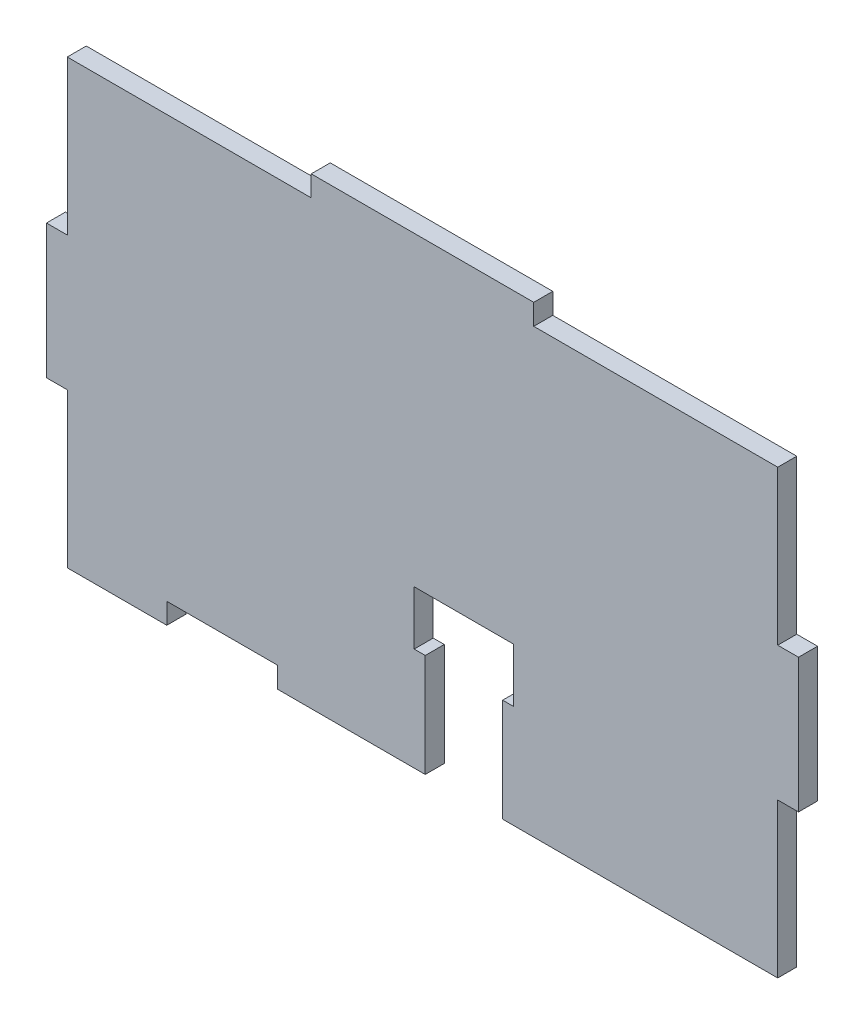
ISO-10303-21;
HEADER;
FILE_DESCRIPTION(('STEP AP214'),'2;1');
FILE_NAME('part.step','',(''),(''),'','','');
FILE_SCHEMA(('AUTOMOTIVE_DESIGN { 1 0 10303 214 1 1 1 1 }'));
ENDSEC;
DATA;
#1=APPLICATION_CONTEXT('core data for automotive mechanical design processes');
#2=APPLICATION_PROTOCOL_DEFINITION('international standard','automotive_design',2000,#1);
#3=PRODUCT_CONTEXT('',#1,'mechanical');
#4=PRODUCT('Part','Part','',(#3));
#5=PRODUCT_RELATED_PRODUCT_CATEGORY('part','',(#4));
#6=PRODUCT_DEFINITION_FORMATION('','',#4);
#7=PRODUCT_DEFINITION_CONTEXT('part definition',#1,'design');
#8=PRODUCT_DEFINITION('design','',#6,#7);
#9=PRODUCT_DEFINITION_SHAPE('','',#8);
#10=(LENGTH_UNIT() NAMED_UNIT(*) SI_UNIT(.MILLI.,.METRE.));
#11=(NAMED_UNIT(*) PLANE_ANGLE_UNIT() SI_UNIT($,.RADIAN.));
#12=(NAMED_UNIT(*) SI_UNIT($,.STERADIAN.) SOLID_ANGLE_UNIT());
#13=UNCERTAINTY_MEASURE_WITH_UNIT(LENGTH_MEASURE(1.E-05),#10,'distance_accuracy_value','');
#14=(GEOMETRIC_REPRESENTATION_CONTEXT(3) GLOBAL_UNCERTAINTY_ASSIGNED_CONTEXT((#13)) GLOBAL_UNIT_ASSIGNED_CONTEXT((#10,
#11,#12)) REPRESENTATION_CONTEXT('',''));
#15=CARTESIAN_POINT('',(0.,0.,0.));
#16=DIRECTION('',(0.,0.,1.));
#17=DIRECTION('',(1.,0.,0.));
#18=AXIS2_PLACEMENT_3D('',#15,#16,#17);
#19=CARTESIAN_POINT('',(0.,0.,4.3));
#20=DIRECTION('',(1.,0.,0.));
#21=DIRECTION('',(0.,0.,-1.));
#22=AXIS2_PLACEMENT_3D('',#19,#20,#21);
#23=PLANE('',#22);
#24=DIRECTION('',(0.,-1.,0.));
#25=VECTOR('',#24,1.);
#26=CARTESIAN_POINT('',(0.,0.,0.));
#27=LINE('',#26,#25);
#28=CARTESIAN_POINT('',(0.,34.85,0.));
#29=VERTEX_POINT('',#28);
#30=CARTESIAN_POINT('',(0.,0.,0.));
#31=VERTEX_POINT('',#30);
#32=EDGE_CURVE('E252',#29,#31,#27,.T.);
#33=ORIENTED_EDGE('',*,*,#32,.T.);
#34=DIRECTION('',(0.,0.,-1.));
#35=VECTOR('',#34,1.);
#36=CARTESIAN_POINT('',(0.,0.,4.3));
#37=LINE('',#36,#35);
#38=CARTESIAN_POINT('',(0.,0.,4.3));
#39=VERTEX_POINT('',#38);
#40=EDGE_CURVE('E11',#39,#31,#37,.T.);
#41=ORIENTED_EDGE('',*,*,#40,.F.);
#42=DIRECTION('',(0.,-1.,0.));
#43=VECTOR('',#42,1.);
#44=CARTESIAN_POINT('',(0.,0.,4.3));
#45=LINE('',#44,#43);
#46=CARTESIAN_POINT('',(0.,34.85,4.3));
#47=VERTEX_POINT('',#46);
#48=EDGE_CURVE('E308',#47,#39,#45,.T.);
#49=ORIENTED_EDGE('',*,*,#48,.F.);
#50=DIRECTION('',(0.,0.,-1.));
#51=VECTOR('',#50,1.);
#52=CARTESIAN_POINT('',(0.,34.85,4.3));
#53=LINE('',#52,#51);
#54=EDGE_CURVE('E248',#47,#29,#53,.T.);
#55=ORIENTED_EDGE('',*,*,#54,.T.);
#56=EDGE_LOOP('',(#33,#41,#49,#55));
#57=FACE_BOUND('',#56,.T.);
#58=ADVANCED_FACE('F36',(#57),#23,.F.);
#59=CARTESIAN_POINT('',(0.,0.,4.3));
#60=DIRECTION('',(0.,1.,0.));
#61=DIRECTION('',(-1.,0.,0.));
#62=AXIS2_PLACEMENT_3D('',#59,#60,#61);
#63=PLANE('',#62);
#64=DIRECTION('',(1.,0.,0.));
#65=VECTOR('',#64,1.);
#66=CARTESIAN_POINT('',(0.,0.,0.));
#67=LINE('',#66,#65);
#68=CARTESIAN_POINT('',(22.5,0.,0.));
#69=VERTEX_POINT('',#68);
#70=EDGE_CURVE('E255',#31,#69,#67,.T.);
#71=ORIENTED_EDGE('',*,*,#70,.T.);
#72=DIRECTION('',(0.,0.,-1.));
#73=VECTOR('',#72,1.);
#74=CARTESIAN_POINT('',(22.5,0.,4.3));
#75=LINE('',#74,#73);
#76=CARTESIAN_POINT('',(22.5,0.,4.3));
#77=VERTEX_POINT('',#76);
#78=EDGE_CURVE('E44',#77,#69,#75,.T.);
#79=ORIENTED_EDGE('',*,*,#78,.F.);
#80=DIRECTION('',(1.,0.,0.));
#81=VECTOR('',#80,1.);
#82=CARTESIAN_POINT('',(0.,0.,4.3));
#83=LINE('',#82,#81);
#84=EDGE_CURVE('E155',#39,#77,#83,.T.);
#85=ORIENTED_EDGE('',*,*,#84,.F.);
#86=ORIENTED_EDGE('',*,*,#40,.T.);
#87=EDGE_LOOP('',(#71,#79,#85,#86));
#88=FACE_BOUND('',#87,.T.);
#89=ADVANCED_FACE('F465',(#88),#63,.F.);
#90=CARTESIAN_POINT('',(22.5,0.,4.3));
#91=DIRECTION('',(-1.,0.,0.));
#92=DIRECTION('',(0.,0.,1.));
#93=AXIS2_PLACEMENT_3D('',#90,#91,#92);
#94=PLANE('',#93);
#95=DIRECTION('',(0.,1.,0.));
#96=VECTOR('',#95,1.);
#97=CARTESIAN_POINT('',(22.5,0.,0.));
#98=LINE('',#97,#96);
#99=CARTESIAN_POINT('',(22.5,4.7,0.));
#100=VERTEX_POINT('',#99);
#101=EDGE_CURVE('E257',#69,#100,#98,.T.);
#102=ORIENTED_EDGE('',*,*,#101,.T.);
#103=DIRECTION('',(0.,0.,-1.));
#104=VECTOR('',#103,1.);
#105=CARTESIAN_POINT('',(22.5,4.7,4.3));
#106=LINE('',#105,#104);
#107=CARTESIAN_POINT('',(22.5,4.7,4.3));
#108=VERTEX_POINT('',#107);
#109=EDGE_CURVE('E375',#108,#100,#106,.T.);
#110=ORIENTED_EDGE('',*,*,#109,.F.);
#111=DIRECTION('',(0.,1.,0.));
#112=VECTOR('',#111,1.);
#113=CARTESIAN_POINT('',(22.5,0.,4.3));
#114=LINE('',#113,#112);
#115=EDGE_CURVE('E383',#77,#108,#114,.T.);
#116=ORIENTED_EDGE('',*,*,#115,.F.);
#117=ORIENTED_EDGE('',*,*,#78,.T.);
#118=EDGE_LOOP('',(#102,#110,#116,#117));
#119=FACE_BOUND('',#118,.T.);
#120=ADVANCED_FACE('F381',(#119),#94,.F.);
#121=CARTESIAN_POINT('',(22.5,4.7,4.3));
#122=DIRECTION('',(0.,1.,0.));
#123=DIRECTION('',(-1.,0.,0.));
#124=AXIS2_PLACEMENT_3D('',#121,#122,#123);
#125=PLANE('',#124);
#126=DIRECTION('',(1.,0.,0.));
#127=VECTOR('',#126,1.);
#128=CARTESIAN_POINT('',(22.5,4.7,0.));
#129=LINE('',#128,#127);
#130=CARTESIAN_POINT('',(47.5,4.70000000000001,0.));
#131=VERTEX_POINT('',#130);
#132=EDGE_CURVE('E259',#100,#131,#129,.T.);
#133=ORIENTED_EDGE('',*,*,#132,.T.);
#134=DIRECTION('',(0.,0.,-1.));
#135=VECTOR('',#134,1.);
#136=CARTESIAN_POINT('',(47.5,4.70000000000001,4.3));
#137=LINE('',#136,#135);
#138=CARTESIAN_POINT('',(47.5,4.70000000000001,4.3));
#139=VERTEX_POINT('',#138);
#140=EDGE_CURVE('E372',#139,#131,#137,.T.);
#141=ORIENTED_EDGE('',*,*,#140,.F.);
#142=DIRECTION('',(1.,0.,0.));
#143=VECTOR('',#142,1.);
#144=CARTESIAN_POINT('',(22.5,4.7,4.3));
#145=LINE('',#144,#143);
#146=EDGE_CURVE('E400',#108,#139,#145,.T.);
#147=ORIENTED_EDGE('',*,*,#146,.F.);
#148=ORIENTED_EDGE('',*,*,#109,.T.);
#149=EDGE_LOOP('',(#133,#141,#147,#148));
#150=FACE_BOUND('',#149,.T.);
#151=ADVANCED_FACE('F391',(#150),#125,.F.);
#152=CARTESIAN_POINT('',(47.5,0.,4.3));
#153=DIRECTION('',(1.,0.,0.));
#154=DIRECTION('',(0.,1.,0.));
#155=AXIS2_PLACEMENT_3D('',#152,#153,#154);
#156=PLANE('',#155);
#157=DIRECTION('',(0.,-1.,0.));
#158=VECTOR('',#157,1.);
#159=CARTESIAN_POINT('',(47.5,0.,0.));
#160=LINE('',#159,#158);
#161=CARTESIAN_POINT('',(47.5,0.,0.));
#162=VERTEX_POINT('',#161);
#163=EDGE_CURVE('E261',#131,#162,#160,.T.);
#164=ORIENTED_EDGE('',*,*,#163,.T.);
#165=DIRECTION('',(0.,0.,-1.));
#166=VECTOR('',#165,1.);
#167=CARTESIAN_POINT('',(47.5,0.,4.3));
#168=LINE('',#167,#166);
#169=CARTESIAN_POINT('',(47.5,0.,4.3));
#170=VERTEX_POINT('',#169);
#171=EDGE_CURVE('E369',#170,#162,#168,.T.);
#172=ORIENTED_EDGE('',*,*,#171,.F.);
#173=DIRECTION('',(0.,-1.,0.));
#174=VECTOR('',#173,1.);
#175=CARTESIAN_POINT('',(47.5,0.,4.3));
#176=LINE('',#175,#174);
#177=EDGE_CURVE('E397',#139,#170,#176,.T.);
#178=ORIENTED_EDGE('',*,*,#177,.F.);
#179=ORIENTED_EDGE('',*,*,#140,.T.);
#180=EDGE_LOOP('',(#164,#172,#178,#179));
#181=FACE_BOUND('',#180,.T.);
#182=ADVANCED_FACE('F395',(#181),#156,.F.);
#183=CARTESIAN_POINT('',(80.92,0.,4.3));
#184=DIRECTION('',(0.,1.,0.));
#185=DIRECTION('',(-1.,0.,0.));
#186=AXIS2_PLACEMENT_3D('',#183,#184,#185);
#187=PLANE('',#186);
#188=DIRECTION('',(1.,0.,0.));
#189=VECTOR('',#188,1.);
#190=CARTESIAN_POINT('',(80.92,0.,0.));
#191=LINE('',#190,#189);
#192=CARTESIAN_POINT('',(80.92,0.,0.));
#193=VERTEX_POINT('',#192);
#194=EDGE_CURVE('E264',#162,#193,#191,.T.);
#195=ORIENTED_EDGE('',*,*,#194,.T.);
#196=DIRECTION('',(0.,0.,-1.));
#197=VECTOR('',#196,1.);
#198=CARTESIAN_POINT('',(80.92,0.,4.3));
#199=LINE('',#198,#197);
#200=CARTESIAN_POINT('',(80.92,0.,4.3));
#201=VERTEX_POINT('',#200);
#202=EDGE_CURVE('E366',#201,#193,#199,.T.);
#203=ORIENTED_EDGE('',*,*,#202,.F.);
#204=DIRECTION('',(1.,0.,0.));
#205=VECTOR('',#204,1.);
#206=CARTESIAN_POINT('',(47.5,0.,4.3));
#207=LINE('',#206,#205);
#208=EDGE_CURVE('E399',#170,#201,#207,.T.);
#209=ORIENTED_EDGE('',*,*,#208,.F.);
#210=ORIENTED_EDGE('',*,*,#171,.T.);
#211=EDGE_LOOP('',(#195,#203,#209,#210));
#212=FACE_BOUND('',#211,.T.);
#213=ADVANCED_FACE('F478',(#212),#187,.F.);
#214=CARTESIAN_POINT('',(80.92,23.3000000001531,4.3));
#215=DIRECTION('',(-1.,0.,0.));
#216=DIRECTION('',(0.,0.,1.));
#217=AXIS2_PLACEMENT_3D('',#214,#215,#216);
#218=PLANE('',#217);
#219=DIRECTION('',(0.,1.,0.));
#220=VECTOR('',#219,1.);
#221=CARTESIAN_POINT('',(80.92,23.3000000001531,0.));
#222=LINE('',#221,#220);
#223=CARTESIAN_POINT('',(80.92,23.3000000001531,0.));
#224=VERTEX_POINT('',#223);
#225=EDGE_CURVE('E266',#193,#224,#222,.T.);
#226=ORIENTED_EDGE('',*,*,#225,.T.);
#227=DIRECTION('',(0.,0.,-1.));
#228=VECTOR('',#227,1.);
#229=CARTESIAN_POINT('',(80.92,23.3000000001531,4.3));
#230=LINE('',#229,#228);
#231=CARTESIAN_POINT('',(80.92,23.3000000001531,4.3));
#232=VERTEX_POINT('',#231);
#233=EDGE_CURVE('E363',#232,#224,#230,.T.);
#234=ORIENTED_EDGE('',*,*,#233,.F.);
#235=DIRECTION('',(0.,1.,0.));
#236=VECTOR('',#235,1.);
#237=CARTESIAN_POINT('',(80.92,23.3000000001531,4.3));
#238=LINE('',#237,#236);
#239=EDGE_CURVE('E402',#201,#232,#238,.T.);
#240=ORIENTED_EDGE('',*,*,#239,.F.);
#241=ORIENTED_EDGE('',*,*,#202,.T.);
#242=EDGE_LOOP('',(#226,#234,#240,#241));
#243=FACE_BOUND('',#242,.T.);
#244=ADVANCED_FACE('F481',(#243),#218,.F.);
#245=CARTESIAN_POINT('',(78.42,23.3000000001531,4.3));
#246=DIRECTION('',(0.,-1.,0.));
#247=DIRECTION('',(0.,0.,-1.));
#248=AXIS2_PLACEMENT_3D('',#245,#246,#247);
#249=PLANE('',#248);
#250=DIRECTION('',(-1.,0.,0.));
#251=VECTOR('',#250,1.);
#252=CARTESIAN_POINT('',(78.42,23.3000000001531,0.));
#253=LINE('',#252,#251);
#254=CARTESIAN_POINT('',(78.42,23.3000000001531,0.));
#255=VERTEX_POINT('',#254);
#256=EDGE_CURVE('E268',#224,#255,#253,.T.);
#257=ORIENTED_EDGE('',*,*,#256,.T.);
#258=DIRECTION('',(0.,0.,-1.));
#259=VECTOR('',#258,1.);
#260=CARTESIAN_POINT('',(78.42,23.3000000001531,4.3));
#261=LINE('',#260,#259);
#262=CARTESIAN_POINT('',(78.42,23.3000000001531,4.3));
#263=VERTEX_POINT('',#262);
#264=EDGE_CURVE('E360',#263,#255,#261,.T.);
#265=ORIENTED_EDGE('',*,*,#264,.F.);
#266=DIRECTION('',(-1.,0.,0.));
#267=VECTOR('',#266,1.);
#268=CARTESIAN_POINT('',(78.42,23.3000000001531,4.3));
#269=LINE('',#268,#267);
#270=EDGE_CURVE('E408',#232,#263,#269,.T.);
#271=ORIENTED_EDGE('',*,*,#270,.F.);
#272=ORIENTED_EDGE('',*,*,#233,.T.);
#273=EDGE_LOOP('',(#257,#265,#271,#272));
#274=FACE_BOUND('',#273,.T.);
#275=ADVANCED_FACE('F485',(#274),#249,.F.);
#276=CARTESIAN_POINT('',(78.42,23.3000000001531,4.3));
#277=DIRECTION('',(-1.,0.,0.));
#278=DIRECTION('',(0.,0.,1.));
#279=AXIS2_PLACEMENT_3D('',#276,#277,#278);
#280=PLANE('',#279);
#281=DIRECTION('',(0.,1.,0.));
#282=VECTOR('',#281,1.);
#283=CARTESIAN_POINT('',(78.42,23.3000000001531,0.));
#284=LINE('',#283,#282);
#285=CARTESIAN_POINT('',(78.42,35.5000000001531,0.));
#286=VERTEX_POINT('',#285);
#287=EDGE_CURVE('E270',#255,#286,#284,.T.);
#288=ORIENTED_EDGE('',*,*,#287,.T.);
#289=DIRECTION('',(0.,0.,-1.));
#290=VECTOR('',#289,1.);
#291=CARTESIAN_POINT('',(78.42,35.5000000001531,4.3));
#292=LINE('',#291,#290);
#293=CARTESIAN_POINT('',(78.42,35.5000000001531,4.3));
#294=VERTEX_POINT('',#293);
#295=EDGE_CURVE('E357',#294,#286,#292,.T.);
#296=ORIENTED_EDGE('',*,*,#295,.F.);
#297=DIRECTION('',(0.,1.,0.));
#298=VECTOR('',#297,1.);
#299=CARTESIAN_POINT('',(78.42,23.3000000001531,4.3));
#300=LINE('',#299,#298);
#301=EDGE_CURVE('E410',#263,#294,#300,.T.);
#302=ORIENTED_EDGE('',*,*,#301,.F.);
#303=ORIENTED_EDGE('',*,*,#264,.T.);
#304=EDGE_LOOP('',(#288,#296,#302,#303));
#305=FACE_BOUND('',#304,.T.);
#306=ADVANCED_FACE('F489',(#305),#280,.F.);
#307=CARTESIAN_POINT('',(78.42,35.5000000001531,4.3));
#308=DIRECTION('',(0.,1.,0.));
#309=DIRECTION('',(0.,0.,1.));
#310=AXIS2_PLACEMENT_3D('',#307,#308,#309);
#311=PLANE('',#310);
#312=DIRECTION('',(1.,0.,0.));
#313=VECTOR('',#312,1.);
#314=CARTESIAN_POINT('',(78.42,35.5000000001531,0.));
#315=LINE('',#314,#313);
#316=CARTESIAN_POINT('',(100.92,35.5000000001531,0.));
#317=VERTEX_POINT('',#316);
#318=EDGE_CURVE('E272',#286,#317,#315,.T.);
#319=ORIENTED_EDGE('',*,*,#318,.T.);
#320=DIRECTION('',(0.,0.,-1.));
#321=VECTOR('',#320,1.);
#322=CARTESIAN_POINT('',(100.92,35.5000000001531,4.3));
#323=LINE('',#322,#321);
#324=CARTESIAN_POINT('',(100.92,35.5000000001531,4.3));
#325=VERTEX_POINT('',#324);
#326=EDGE_CURVE('E354',#325,#317,#323,.T.);
#327=ORIENTED_EDGE('',*,*,#326,.F.);
#328=DIRECTION('',(1.,0.,0.));
#329=VECTOR('',#328,1.);
#330=CARTESIAN_POINT('',(78.42,35.5000000001531,4.3));
#331=LINE('',#330,#329);
#332=EDGE_CURVE('E412',#294,#325,#331,.T.);
#333=ORIENTED_EDGE('',*,*,#332,.F.);
#334=ORIENTED_EDGE('',*,*,#295,.T.);
#335=EDGE_LOOP('',(#319,#327,#333,#334));
#336=FACE_BOUND('',#335,.T.);
#337=ADVANCED_FACE('F493',(#336),#311,.F.);
#338=CARTESIAN_POINT('',(100.92,23.3000000001531,4.3));
#339=DIRECTION('',(1.,0.,0.));
#340=DIRECTION('',(0.,0.,-1.));
#341=AXIS2_PLACEMENT_3D('',#338,#339,#340);
#342=PLANE('',#341);
#343=DIRECTION('',(0.,-1.,0.));
#344=VECTOR('',#343,1.);
#345=CARTESIAN_POINT('',(100.92,23.3000000001531,0.));
#346=LINE('',#345,#344);
#347=CARTESIAN_POINT('',(100.92,23.3000000001531,0.));
#348=VERTEX_POINT('',#347);
#349=EDGE_CURVE('E274',#317,#348,#346,.T.);
#350=ORIENTED_EDGE('',*,*,#349,.T.);
#351=DIRECTION('',(0.,0.,-1.));
#352=VECTOR('',#351,1.);
#353=CARTESIAN_POINT('',(100.92,23.3000000001531,4.3));
#354=LINE('',#353,#352);
#355=CARTESIAN_POINT('',(100.92,23.3000000001531,4.3));
#356=VERTEX_POINT('',#355);
#357=EDGE_CURVE('E351',#356,#348,#354,.T.);
#358=ORIENTED_EDGE('',*,*,#357,.F.);
#359=DIRECTION('',(0.,-1.,0.));
#360=VECTOR('',#359,1.);
#361=CARTESIAN_POINT('',(100.92,23.3000000001531,4.3));
#362=LINE('',#361,#360);
#363=EDGE_CURVE('E414',#325,#356,#362,.T.);
#364=ORIENTED_EDGE('',*,*,#363,.F.);
#365=ORIENTED_EDGE('',*,*,#326,.T.);
#366=EDGE_LOOP('',(#350,#358,#364,#365));
#367=FACE_BOUND('',#366,.T.);
#368=ADVANCED_FACE('F497',(#367),#342,.F.);
#369=CARTESIAN_POINT('',(100.92,23.3000000001531,4.3));
#370=DIRECTION('',(0.,-1.,0.));
#371=DIRECTION('',(1.,0.,0.));
#372=AXIS2_PLACEMENT_3D('',#369,#370,#371);
#373=PLANE('',#372);
#374=DIRECTION('',(-1.,0.,0.));
#375=VECTOR('',#374,1.);
#376=CARTESIAN_POINT('',(100.92,23.3000000001531,0.));
#377=LINE('',#376,#375);
#378=CARTESIAN_POINT('',(98.42,23.3000000001531,0.));
#379=VERTEX_POINT('',#378);
#380=EDGE_CURVE('E276',#348,#379,#377,.T.);
#381=ORIENTED_EDGE('',*,*,#380,.T.);
#382=DIRECTION('',(0.,0.,-1.));
#383=VECTOR('',#382,1.);
#384=CARTESIAN_POINT('',(98.42,23.3000000001531,4.3));
#385=LINE('',#384,#383);
#386=CARTESIAN_POINT('',(98.42,23.3000000001531,4.3));
#387=VERTEX_POINT('',#386);
#388=EDGE_CURVE('E348',#387,#379,#385,.T.);
#389=ORIENTED_EDGE('',*,*,#388,.F.);
#390=DIRECTION('',(-1.,0.,0.));
#391=VECTOR('',#390,1.);
#392=CARTESIAN_POINT('',(100.92,23.3000000001531,4.3));
#393=LINE('',#392,#391);
#394=EDGE_CURVE('E416',#356,#387,#393,.T.);
#395=ORIENTED_EDGE('',*,*,#394,.F.);
#396=ORIENTED_EDGE('',*,*,#357,.T.);
#397=EDGE_LOOP('',(#381,#389,#395,#396));
#398=FACE_BOUND('',#397,.T.);
#399=ADVANCED_FACE('F501',(#398),#373,.F.);
#400=CARTESIAN_POINT('',(98.42,23.3000000001531,4.3));
#401=DIRECTION('',(1.,0.,0.));
#402=DIRECTION('',(0.,0.,-1.));
#403=AXIS2_PLACEMENT_3D('',#400,#401,#402);
#404=PLANE('',#403);
#405=DIRECTION('',(0.,-1.,0.));
#406=VECTOR('',#405,1.);
#407=CARTESIAN_POINT('',(98.42,23.3000000001531,0.));
#408=LINE('',#407,#406);
#409=CARTESIAN_POINT('',(98.42,0.,0.));
#410=VERTEX_POINT('',#409);
#411=EDGE_CURVE('E278',#379,#410,#408,.T.);
#412=ORIENTED_EDGE('',*,*,#411,.T.);
#413=DIRECTION('',(0.,0.,-1.));
#414=VECTOR('',#413,1.);
#415=CARTESIAN_POINT('',(98.42,0.,4.3));
#416=LINE('',#415,#414);
#417=CARTESIAN_POINT('',(98.42,0.,4.3));
#418=VERTEX_POINT('',#417);
#419=EDGE_CURVE('E345',#418,#410,#416,.T.);
#420=ORIENTED_EDGE('',*,*,#419,.F.);
#421=DIRECTION('',(0.,-1.,0.));
#422=VECTOR('',#421,1.);
#423=CARTESIAN_POINT('',(98.42,23.3000000001531,4.3));
#424=LINE('',#423,#422);
#425=EDGE_CURVE('E418',#387,#418,#424,.T.);
#426=ORIENTED_EDGE('',*,*,#425,.F.);
#427=ORIENTED_EDGE('',*,*,#388,.T.);
#428=EDGE_LOOP('',(#412,#420,#426,#427));
#429=FACE_BOUND('',#428,.T.);
#430=ADVANCED_FACE('F505',(#429),#404,.F.);
#431=CARTESIAN_POINT('',(105.849999999998,0.,4.3));
#432=DIRECTION('',(0.,1.,0.));
#433=DIRECTION('',(0.,0.,1.));
#434=AXIS2_PLACEMENT_3D('',#431,#432,#433);
#435=PLANE('',#434);
#436=DIRECTION('',(1.,0.,0.));
#437=VECTOR('',#436,1.);
#438=CARTESIAN_POINT('',(105.849999999998,0.,0.));
#439=LINE('',#438,#437);
#440=CARTESIAN_POINT('',(160.6,0.,0.));
#441=VERTEX_POINT('',#440);
#442=EDGE_CURVE('E281',#410,#441,#439,.T.);
#443=ORIENTED_EDGE('',*,*,#442,.T.);
#444=DIRECTION('',(0.,0.,-1.));
#445=VECTOR('',#444,1.);
#446=CARTESIAN_POINT('',(160.6,0.,4.3));
#447=LINE('',#446,#445);
#448=CARTESIAN_POINT('',(160.6,0.,4.3));
#449=VERTEX_POINT('',#448);
#450=EDGE_CURVE('E342',#449,#441,#447,.T.);
#451=ORIENTED_EDGE('',*,*,#450,.F.);
#452=DIRECTION('',(1.,0.,0.));
#453=VECTOR('',#452,1.);
#454=CARTESIAN_POINT('',(98.42,0.,4.3));
#455=LINE('',#454,#453);
#456=EDGE_CURVE('E420',#418,#449,#455,.T.);
#457=ORIENTED_EDGE('',*,*,#456,.F.);
#458=ORIENTED_EDGE('',*,*,#419,.T.);
#459=EDGE_LOOP('',(#443,#451,#457,#458));
#460=FACE_BOUND('',#459,.T.);
#461=ADVANCED_FACE('F509',(#460),#435,.F.);
#462=CARTESIAN_POINT('',(160.6,0.,4.3));
#463=DIRECTION('',(-1.,0.,0.));
#464=DIRECTION('',(0.,-1.,0.));
#465=AXIS2_PLACEMENT_3D('',#462,#463,#464);
#466=PLANE('',#465);
#467=DIRECTION('',(0.,1.,0.));
#468=VECTOR('',#467,1.);
#469=CARTESIAN_POINT('',(160.6,0.,0.));
#470=LINE('',#469,#468);
#471=CARTESIAN_POINT('',(160.6,34.85,0.));
#472=VERTEX_POINT('',#471);
#473=EDGE_CURVE('E283',#441,#472,#470,.T.);
#474=ORIENTED_EDGE('',*,*,#473,.T.);
#475=DIRECTION('',(0.,0.,-1.));
#476=VECTOR('',#475,1.);
#477=CARTESIAN_POINT('',(160.6,34.85,4.3));
#478=LINE('',#477,#476);
#479=CARTESIAN_POINT('',(160.6,34.85,4.3));
#480=VERTEX_POINT('',#479);
#481=EDGE_CURVE('E339',#480,#472,#478,.T.);
#482=ORIENTED_EDGE('',*,*,#481,.F.);
#483=DIRECTION('',(0.,1.,0.));
#484=VECTOR('',#483,1.);
#485=CARTESIAN_POINT('',(160.6,0.,4.3));
#486=LINE('',#485,#484);
#487=EDGE_CURVE('E422',#449,#480,#486,.T.);
#488=ORIENTED_EDGE('',*,*,#487,.F.);
#489=ORIENTED_EDGE('',*,*,#450,.T.);
#490=EDGE_LOOP('',(#474,#482,#488,#489));
#491=FACE_BOUND('',#490,.T.);
#492=ADVANCED_FACE('F513',(#491),#466,.F.);
#493=CARTESIAN_POINT('',(160.6,34.85,4.3));
#494=DIRECTION('',(0.,1.,0.));
#495=DIRECTION('',(-1.,0.,0.));
#496=AXIS2_PLACEMENT_3D('',#493,#494,#495);
#497=PLANE('',#496);
#498=DIRECTION('',(1.,0.,0.));
#499=VECTOR('',#498,1.);
#500=CARTESIAN_POINT('',(160.6,34.85,0.));
#501=LINE('',#500,#499);
#502=CARTESIAN_POINT('',(165.3,34.85,0.));
#503=VERTEX_POINT('',#502);
#504=EDGE_CURVE('E285',#472,#503,#501,.T.);
#505=ORIENTED_EDGE('',*,*,#504,.T.);
#506=DIRECTION('',(0.,0.,-1.));
#507=VECTOR('',#506,1.);
#508=CARTESIAN_POINT('',(165.3,34.85,4.3));
#509=LINE('',#508,#507);
#510=CARTESIAN_POINT('',(165.3,34.85,4.3));
#511=VERTEX_POINT('',#510);
#512=EDGE_CURVE('E336',#511,#503,#509,.T.);
#513=ORIENTED_EDGE('',*,*,#512,.F.);
#514=DIRECTION('',(1.,0.,0.));
#515=VECTOR('',#514,1.);
#516=CARTESIAN_POINT('',(160.6,34.85,4.3));
#517=LINE('',#516,#515);
#518=EDGE_CURVE('E424',#480,#511,#517,.T.);
#519=ORIENTED_EDGE('',*,*,#518,.F.);
#520=ORIENTED_EDGE('',*,*,#481,.T.);
#521=EDGE_LOOP('',(#505,#513,#519,#520));
#522=FACE_BOUND('',#521,.T.);
#523=ADVANCED_FACE('F517',(#522),#497,.F.);
#524=CARTESIAN_POINT('',(165.3,34.85,4.3));
#525=DIRECTION('',(-1.,0.,0.));
#526=DIRECTION('',(0.,0.,1.));
#527=AXIS2_PLACEMENT_3D('',#524,#525,#526);
#528=PLANE('',#527);
#529=DIRECTION('',(0.,1.,0.));
#530=VECTOR('',#529,1.);
#531=CARTESIAN_POINT('',(165.3,34.85,0.));
#532=LINE('',#531,#530);
#533=CARTESIAN_POINT('',(165.3,65.15,0.));
#534=VERTEX_POINT('',#533);
#535=EDGE_CURVE('E287',#503,#534,#532,.T.);
#536=ORIENTED_EDGE('',*,*,#535,.T.);
#537=DIRECTION('',(0.,0.,-1.));
#538=VECTOR('',#537,1.);
#539=CARTESIAN_POINT('',(165.3,65.15,4.3));
#540=LINE('',#539,#538);
#541=CARTESIAN_POINT('',(165.3,65.15,4.3));
#542=VERTEX_POINT('',#541);
#543=EDGE_CURVE('E333',#542,#534,#540,.T.);
#544=ORIENTED_EDGE('',*,*,#543,.F.);
#545=DIRECTION('',(0.,1.,0.));
#546=VECTOR('',#545,1.);
#547=CARTESIAN_POINT('',(165.3,34.85,4.3));
#548=LINE('',#547,#546);
#549=EDGE_CURVE('E426',#511,#542,#548,.T.);
#550=ORIENTED_EDGE('',*,*,#549,.F.);
#551=ORIENTED_EDGE('',*,*,#512,.T.);
#552=EDGE_LOOP('',(#536,#544,#550,#551));
#553=FACE_BOUND('',#552,.T.);
#554=ADVANCED_FACE('F521',(#553),#528,.F.);
#555=CARTESIAN_POINT('',(160.6,65.15,4.3));
#556=DIRECTION('',(0.,-1.,0.));
#557=DIRECTION('',(1.,0.,0.));
#558=AXIS2_PLACEMENT_3D('',#555,#556,#557);
#559=PLANE('',#558);
#560=DIRECTION('',(-1.,0.,0.));
#561=VECTOR('',#560,1.);
#562=CARTESIAN_POINT('',(160.6,65.15,0.));
#563=LINE('',#562,#561);
#564=CARTESIAN_POINT('',(160.6,65.15,0.));
#565=VERTEX_POINT('',#564);
#566=EDGE_CURVE('E289',#534,#565,#563,.T.);
#567=ORIENTED_EDGE('',*,*,#566,.T.);
#568=DIRECTION('',(0.,0.,-1.));
#569=VECTOR('',#568,1.);
#570=CARTESIAN_POINT('',(160.6,65.15,4.3));
#571=LINE('',#570,#569);
#572=CARTESIAN_POINT('',(160.6,65.15,4.3));
#573=VERTEX_POINT('',#572);
#574=EDGE_CURVE('E330',#573,#565,#571,.T.);
#575=ORIENTED_EDGE('',*,*,#574,.F.);
#576=DIRECTION('',(-1.,0.,0.));
#577=VECTOR('',#576,1.);
#578=CARTESIAN_POINT('',(160.6,65.15,4.3));
#579=LINE('',#578,#577);
#580=EDGE_CURVE('E428',#542,#573,#579,.T.);
#581=ORIENTED_EDGE('',*,*,#580,.F.);
#582=ORIENTED_EDGE('',*,*,#543,.T.);
#583=EDGE_LOOP('',(#567,#575,#581,#582));
#584=FACE_BOUND('',#583,.T.);
#585=ADVANCED_FACE('F525',(#584),#559,.F.);
#586=CARTESIAN_POINT('',(160.6,65.15,4.3));
#587=DIRECTION('',(-1.,0.,0.));
#588=DIRECTION('',(0.,-1.,0.));
#589=AXIS2_PLACEMENT_3D('',#586,#587,#588);
#590=PLANE('',#589);
#591=DIRECTION('',(0.,1.,0.));
#592=VECTOR('',#591,1.);
#593=CARTESIAN_POINT('',(160.6,65.15,0.));
#594=LINE('',#593,#592);
#595=CARTESIAN_POINT('',(160.6,100.,0.));
#596=VERTEX_POINT('',#595);
#597=EDGE_CURVE('E291',#565,#596,#594,.T.);
#598=ORIENTED_EDGE('',*,*,#597,.T.);
#599=DIRECTION('',(0.,0.,-1.));
#600=VECTOR('',#599,1.);
#601=CARTESIAN_POINT('',(160.6,100.,4.3));
#602=LINE('',#601,#600);
#603=CARTESIAN_POINT('',(160.6,100.,4.3));
#604=VERTEX_POINT('',#603);
#605=EDGE_CURVE('E327',#604,#596,#602,.T.);
#606=ORIENTED_EDGE('',*,*,#605,.F.);
#607=DIRECTION('',(0.,1.,0.));
#608=VECTOR('',#607,1.);
#609=CARTESIAN_POINT('',(160.6,65.15,4.3));
#610=LINE('',#609,#608);
#611=EDGE_CURVE('E430',#573,#604,#610,.T.);
#612=ORIENTED_EDGE('',*,*,#611,.F.);
#613=ORIENTED_EDGE('',*,*,#574,.T.);
#614=EDGE_LOOP('',(#598,#606,#612,#613));
#615=FACE_BOUND('',#614,.T.);
#616=ADVANCED_FACE('F529',(#615),#590,.F.);
#617=CARTESIAN_POINT('',(105.45,100.,4.3));
#618=DIRECTION('',(0.,-1.,0.));
#619=DIRECTION('',(0.,0.,-1.));
#620=AXIS2_PLACEMENT_3D('',#617,#618,#619);
#621=PLANE('',#620);
#622=DIRECTION('',(-1.,0.,0.));
#623=VECTOR('',#622,1.);
#624=CARTESIAN_POINT('',(105.45,100.,0.));
#625=LINE('',#624,#623);
#626=CARTESIAN_POINT('',(105.45,100.,0.));
#627=VERTEX_POINT('',#626);
#628=EDGE_CURVE('E293',#596,#627,#625,.T.);
#629=ORIENTED_EDGE('',*,*,#628,.T.);
#630=DIRECTION('',(0.,0.,-1.));
#631=VECTOR('',#630,1.);
#632=CARTESIAN_POINT('',(105.45,100.,4.3));
#633=LINE('',#632,#631);
#634=CARTESIAN_POINT('',(105.45,100.,4.3));
#635=VERTEX_POINT('',#634);
#636=EDGE_CURVE('E324',#635,#627,#633,.T.);
#637=ORIENTED_EDGE('',*,*,#636,.F.);
#638=DIRECTION('',(-1.,0.,0.));
#639=VECTOR('',#638,1.);
#640=CARTESIAN_POINT('',(105.45,100.,4.3));
#641=LINE('',#640,#639);
#642=EDGE_CURVE('E432',#604,#635,#641,.T.);
#643=ORIENTED_EDGE('',*,*,#642,.F.);
#644=ORIENTED_EDGE('',*,*,#605,.T.);
#645=EDGE_LOOP('',(#629,#637,#643,#644));
#646=FACE_BOUND('',#645,.T.);
#647=ADVANCED_FACE('F533',(#646),#621,.F.);
#648=CARTESIAN_POINT('',(105.45,100.,4.3));
#649=DIRECTION('',(-1.,0.,0.));
#650=DIRECTION('',(0.,-1.,0.));
#651=AXIS2_PLACEMENT_3D('',#648,#649,#650);
#652=PLANE('',#651);
#653=DIRECTION('',(0.,1.,0.));
#654=VECTOR('',#653,1.);
#655=CARTESIAN_POINT('',(105.45,100.,0.));
#656=LINE('',#655,#654);
#657=CARTESIAN_POINT('',(105.45,104.7,0.));
#658=VERTEX_POINT('',#657);
#659=EDGE_CURVE('E295',#627,#658,#656,.T.);
#660=ORIENTED_EDGE('',*,*,#659,.T.);
#661=DIRECTION('',(0.,0.,-1.));
#662=VECTOR('',#661,1.);
#663=CARTESIAN_POINT('',(105.45,104.7,4.3));
#664=LINE('',#663,#662);
#665=CARTESIAN_POINT('',(105.45,104.7,4.3));
#666=VERTEX_POINT('',#665);
#667=EDGE_CURVE('E321',#666,#658,#664,.T.);
#668=ORIENTED_EDGE('',*,*,#667,.F.);
#669=DIRECTION('',(0.,1.,0.));
#670=VECTOR('',#669,1.);
#671=CARTESIAN_POINT('',(105.45,100.,4.3));
#672=LINE('',#671,#670);
#673=EDGE_CURVE('E434',#635,#666,#672,.T.);
#674=ORIENTED_EDGE('',*,*,#673,.F.);
#675=ORIENTED_EDGE('',*,*,#636,.T.);
#676=EDGE_LOOP('',(#660,#668,#674,#675));
#677=FACE_BOUND('',#676,.T.);
#678=ADVANCED_FACE('F537',(#677),#652,.F.);
#679=CARTESIAN_POINT('',(55.15,104.7,4.3));
#680=DIRECTION('',(0.,-1.,0.));
#681=DIRECTION('',(1.,0.,0.));
#682=AXIS2_PLACEMENT_3D('',#679,#680,#681);
#683=PLANE('',#682);
#684=DIRECTION('',(-1.,0.,0.));
#685=VECTOR('',#684,1.);
#686=CARTESIAN_POINT('',(55.15,104.7,0.));
#687=LINE('',#686,#685);
#688=CARTESIAN_POINT('',(55.15,104.7,0.));
#689=VERTEX_POINT('',#688);
#690=EDGE_CURVE('E297',#658,#689,#687,.T.);
#691=ORIENTED_EDGE('',*,*,#690,.T.);
#692=DIRECTION('',(0.,0.,-1.));
#693=VECTOR('',#692,1.);
#694=CARTESIAN_POINT('',(55.15,104.7,4.3));
#695=LINE('',#694,#693);
#696=CARTESIAN_POINT('',(55.15,104.7,4.3));
#697=VERTEX_POINT('',#696);
#698=EDGE_CURVE('E318',#697,#689,#695,.T.);
#699=ORIENTED_EDGE('',*,*,#698,.F.);
#700=DIRECTION('',(-1.,0.,0.));
#701=VECTOR('',#700,1.);
#702=CARTESIAN_POINT('',(55.15,104.7,4.3));
#703=LINE('',#702,#701);
#704=EDGE_CURVE('E436',#666,#697,#703,.T.);
#705=ORIENTED_EDGE('',*,*,#704,.F.);
#706=ORIENTED_EDGE('',*,*,#667,.T.);
#707=EDGE_LOOP('',(#691,#699,#705,#706));
#708=FACE_BOUND('',#707,.T.);
#709=ADVANCED_FACE('F541',(#708),#683,.F.);
#710=CARTESIAN_POINT('',(55.15,100.,4.3));
#711=DIRECTION('',(1.,0.,0.));
#712=DIRECTION('',(0.,0.,-1.));
#713=AXIS2_PLACEMENT_3D('',#710,#711,#712);
#714=PLANE('',#713);
#715=DIRECTION('',(0.,-1.,0.));
#716=VECTOR('',#715,1.);
#717=CARTESIAN_POINT('',(55.15,100.,0.));
#718=LINE('',#717,#716);
#719=CARTESIAN_POINT('',(55.15,100.,0.));
#720=VERTEX_POINT('',#719);
#721=EDGE_CURVE('E299',#689,#720,#718,.T.);
#722=ORIENTED_EDGE('',*,*,#721,.T.);
#723=DIRECTION('',(0.,0.,-1.));
#724=VECTOR('',#723,1.);
#725=CARTESIAN_POINT('',(55.15,100.,4.3));
#726=LINE('',#725,#724);
#727=CARTESIAN_POINT('',(55.15,100.,4.3));
#728=VERTEX_POINT('',#727);
#729=EDGE_CURVE('E315',#728,#720,#726,.T.);
#730=ORIENTED_EDGE('',*,*,#729,.F.);
#731=DIRECTION('',(0.,-1.,0.));
#732=VECTOR('',#731,1.);
#733=CARTESIAN_POINT('',(55.15,100.,4.3));
#734=LINE('',#733,#732);
#735=EDGE_CURVE('E438',#697,#728,#734,.T.);
#736=ORIENTED_EDGE('',*,*,#735,.F.);
#737=ORIENTED_EDGE('',*,*,#698,.T.);
#738=EDGE_LOOP('',(#722,#730,#736,#737));
#739=FACE_BOUND('',#738,.T.);
#740=ADVANCED_FACE('F545',(#739),#714,.F.);
#741=CARTESIAN_POINT('',(0.,100.,4.3));
#742=DIRECTION('',(0.,-1.,0.));
#743=DIRECTION('',(0.,0.,-1.));
#744=AXIS2_PLACEMENT_3D('',#741,#742,#743);
#745=PLANE('',#744);
#746=DIRECTION('',(-1.,0.,0.));
#747=VECTOR('',#746,1.);
#748=CARTESIAN_POINT('',(0.,100.,0.));
#749=LINE('',#748,#747);
#750=CARTESIAN_POINT('',(0.,100.,0.));
#751=VERTEX_POINT('',#750);
#752=EDGE_CURVE('E301',#720,#751,#749,.T.);
#753=ORIENTED_EDGE('',*,*,#752,.T.);
#754=DIRECTION('',(0.,0.,-1.));
#755=VECTOR('',#754,1.);
#756=CARTESIAN_POINT('',(0.,100.,4.3));
#757=LINE('',#756,#755);
#758=CARTESIAN_POINT('',(0.,100.,4.3));
#759=VERTEX_POINT('',#758);
#760=EDGE_CURVE('E312',#759,#751,#757,.T.);
#761=ORIENTED_EDGE('',*,*,#760,.F.);
#762=DIRECTION('',(-1.,0.,0.));
#763=VECTOR('',#762,1.);
#764=CARTESIAN_POINT('',(0.,100.,4.3));
#765=LINE('',#764,#763);
#766=EDGE_CURVE('E440',#728,#759,#765,.T.);
#767=ORIENTED_EDGE('',*,*,#766,.F.);
#768=ORIENTED_EDGE('',*,*,#729,.T.);
#769=EDGE_LOOP('',(#753,#761,#767,#768));
#770=FACE_BOUND('',#769,.T.);
#771=ADVANCED_FACE('F446',(#770),#745,.F.);
#772=CARTESIAN_POINT('',(0.,65.15,4.3));
#773=DIRECTION('',(1.,0.,0.));
#774=DIRECTION('',(0.,1.,0.));
#775=AXIS2_PLACEMENT_3D('',#772,#773,#774);
#776=PLANE('',#775);
#777=DIRECTION('',(0.,-1.,0.));
#778=VECTOR('',#777,1.);
#779=CARTESIAN_POINT('',(0.,65.15,0.));
#780=LINE('',#779,#778);
#781=CARTESIAN_POINT('',(0.,65.15,0.));
#782=VERTEX_POINT('',#781);
#783=EDGE_CURVE('E303',#751,#782,#780,.T.);
#784=ORIENTED_EDGE('',*,*,#783,.T.);
#785=DIRECTION('',(0.,0.,-1.));
#786=VECTOR('',#785,1.);
#787=CARTESIAN_POINT('',(0.,65.15,4.3));
#788=LINE('',#787,#786);
#789=CARTESIAN_POINT('',(0.,65.15,4.3));
#790=VERTEX_POINT('',#789);
#791=EDGE_CURVE('E243',#790,#782,#788,.T.);
#792=ORIENTED_EDGE('',*,*,#791,.F.);
#793=DIRECTION('',(0.,-1.,0.));
#794=VECTOR('',#793,1.);
#795=CARTESIAN_POINT('',(0.,65.15,4.3));
#796=LINE('',#795,#794);
#797=EDGE_CURVE('E234',#759,#790,#796,.T.);
#798=ORIENTED_EDGE('',*,*,#797,.F.);
#799=ORIENTED_EDGE('',*,*,#760,.T.);
#800=EDGE_LOOP('',(#784,#792,#798,#799));
#801=FACE_BOUND('',#800,.T.);
#802=ADVANCED_FACE('F450',(#801),#776,.F.);
#803=CARTESIAN_POINT('',(-4.69999999999999,65.15,4.3));
#804=DIRECTION('',(0.,-1.,0.));
#805=DIRECTION('',(0.,0.,-1.));
#806=AXIS2_PLACEMENT_3D('',#803,#804,#805);
#807=PLANE('',#806);
#808=DIRECTION('',(-1.,0.,0.));
#809=VECTOR('',#808,1.);
#810=CARTESIAN_POINT('',(-4.69999999999999,65.15,0.));
#811=LINE('',#810,#809);
#812=CARTESIAN_POINT('',(-4.69999999999999,65.15,0.));
#813=VERTEX_POINT('',#812);
#814=EDGE_CURVE('E242',#782,#813,#811,.T.);
#815=ORIENTED_EDGE('',*,*,#814,.T.);
#816=DIRECTION('',(0.,0.,-1.));
#817=VECTOR('',#816,1.);
#818=CARTESIAN_POINT('',(-4.69999999999999,65.15,4.3));
#819=LINE('',#818,#817);
#820=CARTESIAN_POINT('',(-4.69999999999999,65.15,4.3));
#821=VERTEX_POINT('',#820);
#822=EDGE_CURVE('E239',#821,#813,#819,.T.);
#823=ORIENTED_EDGE('',*,*,#822,.F.);
#824=DIRECTION('',(-1.,0.,0.));
#825=VECTOR('',#824,1.);
#826=CARTESIAN_POINT('',(-4.69999999999999,65.15,4.3));
#827=LINE('',#826,#825);
#828=EDGE_CURVE('E228',#790,#821,#827,.T.);
#829=ORIENTED_EDGE('',*,*,#828,.F.);
#830=ORIENTED_EDGE('',*,*,#791,.T.);
#831=EDGE_LOOP('',(#815,#823,#829,#830));
#832=FACE_BOUND('',#831,.T.);
#833=ADVANCED_FACE('F240',(#832),#807,.F.);
#834=CARTESIAN_POINT('',(-4.7,34.85,4.3));
#835=DIRECTION('',(1.,0.,0.));
#836=DIRECTION('',(0.,1.,0.));
#837=AXIS2_PLACEMENT_3D('',#834,#835,#836);
#838=PLANE('',#837);
#839=DIRECTION('',(0.,-1.,0.));
#840=VECTOR('',#839,1.);
#841=CARTESIAN_POINT('',(-4.7,34.85,0.));
#842=LINE('',#841,#840);
#843=CARTESIAN_POINT('',(-4.7,34.85,0.));
#844=VERTEX_POINT('',#843);
#845=EDGE_CURVE('E141',#813,#844,#842,.T.);
#846=ORIENTED_EDGE('',*,*,#845,.T.);
#847=DIRECTION('',(0.,0.,-1.));
#848=VECTOR('',#847,1.);
#849=CARTESIAN_POINT('',(-4.7,34.85,4.3));
#850=LINE('',#849,#848);
#851=CARTESIAN_POINT('',(-4.7,34.85,4.3));
#852=VERTEX_POINT('',#851);
#853=EDGE_CURVE('E244',#852,#844,#850,.T.);
#854=ORIENTED_EDGE('',*,*,#853,.F.);
#855=DIRECTION('',(0.,-1.,0.));
#856=VECTOR('',#855,1.);
#857=CARTESIAN_POINT('',(-4.7,34.85,4.3));
#858=LINE('',#857,#856);
#859=EDGE_CURVE('E232',#821,#852,#858,.T.);
#860=ORIENTED_EDGE('',*,*,#859,.F.);
#861=ORIENTED_EDGE('',*,*,#822,.T.);
#862=EDGE_LOOP('',(#846,#854,#860,#861));
#863=FACE_BOUND('',#862,.T.);
#864=ADVANCED_FACE('F246',(#863),#838,.F.);
#865=CARTESIAN_POINT('',(-4.7,34.85,4.3));
#866=DIRECTION('',(0.,1.,0.));
#867=DIRECTION('',(0.,0.,1.));
#868=AXIS2_PLACEMENT_3D('',#865,#866,#867);
#869=PLANE('',#868);
#870=DIRECTION('',(1.,0.,0.));
#871=VECTOR('',#870,1.);
#872=CARTESIAN_POINT('',(-4.7,34.85,0.));
#873=LINE('',#872,#871);
#874=EDGE_CURVE('E147',#844,#29,#873,.T.);
#875=ORIENTED_EDGE('',*,*,#874,.T.);
#876=ORIENTED_EDGE('',*,*,#54,.F.);
#877=DIRECTION('',(1.,0.,0.));
#878=VECTOR('',#877,1.);
#879=CARTESIAN_POINT('',(-4.7,34.85,4.3));
#880=LINE('',#879,#878);
#881=EDGE_CURVE('E52',#852,#47,#880,.T.);
#882=ORIENTED_EDGE('',*,*,#881,.F.);
#883=ORIENTED_EDGE('',*,*,#853,.T.);
#884=EDGE_LOOP('',(#875,#876,#882,#883));
#885=FACE_BOUND('',#884,.T.);
#886=ADVANCED_FACE('F454',(#885),#869,.F.);
#887=CARTESIAN_POINT('',(0.,0.,4.3));
#888=DIRECTION('',(0.,0.,-1.));
#889=DIRECTION('',(-1.,0.,0.));
#890=AXIS2_PLACEMENT_3D('',#887,#888,#889);
#891=PLANE('',#890);
#892=ORIENTED_EDGE('',*,*,#48,.T.);
#893=ORIENTED_EDGE('',*,*,#84,.T.);
#894=ORIENTED_EDGE('',*,*,#115,.T.);
#895=ORIENTED_EDGE('',*,*,#146,.T.);
#896=ORIENTED_EDGE('',*,*,#177,.T.);
#897=ORIENTED_EDGE('',*,*,#208,.T.);
#898=ORIENTED_EDGE('',*,*,#239,.T.);
#899=ORIENTED_EDGE('',*,*,#270,.T.);
#900=ORIENTED_EDGE('',*,*,#301,.T.);
#901=ORIENTED_EDGE('',*,*,#332,.T.);
#902=ORIENTED_EDGE('',*,*,#363,.T.);
#903=ORIENTED_EDGE('',*,*,#394,.T.);
#904=ORIENTED_EDGE('',*,*,#425,.T.);
#905=ORIENTED_EDGE('',*,*,#456,.T.);
#906=ORIENTED_EDGE('',*,*,#487,.T.);
#907=ORIENTED_EDGE('',*,*,#518,.T.);
#908=ORIENTED_EDGE('',*,*,#549,.T.);
#909=ORIENTED_EDGE('',*,*,#580,.T.);
#910=ORIENTED_EDGE('',*,*,#611,.T.);
#911=ORIENTED_EDGE('',*,*,#642,.T.);
#912=ORIENTED_EDGE('',*,*,#673,.T.);
#913=ORIENTED_EDGE('',*,*,#704,.T.);
#914=ORIENTED_EDGE('',*,*,#735,.T.);
#915=ORIENTED_EDGE('',*,*,#766,.T.);
#916=ORIENTED_EDGE('',*,*,#797,.T.);
#917=ORIENTED_EDGE('',*,*,#828,.T.);
#918=ORIENTED_EDGE('',*,*,#859,.T.);
#919=ORIENTED_EDGE('',*,*,#881,.T.);
#920=EDGE_LOOP('',(#892,#893,#894,#895,#896,#897,#898,#899,#900,#901,#902,#903,#904,#905,#906,
#907,#908,#909,#910,#911,#912,#913,#914,#915,#916,#917,#918,#919));
#921=FACE_BOUND('',#920,.T.);
#922=ADVANCED_FACE('F230',(#921),#891,.F.);
#923=CARTESIAN_POINT('',(0.,0.,0.));
#924=DIRECTION('',(0.,0.,-1.));
#925=DIRECTION('',(-1.,0.,0.));
#926=AXIS2_PLACEMENT_3D('',#923,#924,#925);
#927=PLANE('',#926);
#928=ORIENTED_EDGE('',*,*,#32,.F.);
#929=ORIENTED_EDGE('',*,*,#874,.F.);
#930=ORIENTED_EDGE('',*,*,#845,.F.);
#931=ORIENTED_EDGE('',*,*,#814,.F.);
#932=ORIENTED_EDGE('',*,*,#783,.F.);
#933=ORIENTED_EDGE('',*,*,#752,.F.);
#934=ORIENTED_EDGE('',*,*,#721,.F.);
#935=ORIENTED_EDGE('',*,*,#690,.F.);
#936=ORIENTED_EDGE('',*,*,#659,.F.);
#937=ORIENTED_EDGE('',*,*,#628,.F.);
#938=ORIENTED_EDGE('',*,*,#597,.F.);
#939=ORIENTED_EDGE('',*,*,#566,.F.);
#940=ORIENTED_EDGE('',*,*,#535,.F.);
#941=ORIENTED_EDGE('',*,*,#504,.F.);
#942=ORIENTED_EDGE('',*,*,#473,.F.);
#943=ORIENTED_EDGE('',*,*,#442,.F.);
#944=ORIENTED_EDGE('',*,*,#411,.F.);
#945=ORIENTED_EDGE('',*,*,#380,.F.);
#946=ORIENTED_EDGE('',*,*,#349,.F.);
#947=ORIENTED_EDGE('',*,*,#318,.F.);
#948=ORIENTED_EDGE('',*,*,#287,.F.);
#949=ORIENTED_EDGE('',*,*,#256,.F.);
#950=ORIENTED_EDGE('',*,*,#225,.F.);
#951=ORIENTED_EDGE('',*,*,#194,.F.);
#952=ORIENTED_EDGE('',*,*,#163,.F.);
#953=ORIENTED_EDGE('',*,*,#132,.F.);
#954=ORIENTED_EDGE('',*,*,#101,.F.);
#955=ORIENTED_EDGE('',*,*,#70,.F.);
#956=EDGE_LOOP('',(#928,#929,#930,#931,#932,#933,#934,#935,#936,#937,#938,#939,#940,#941,#942,
#943,#944,#945,#946,#947,#948,#949,#950,#951,#952,#953,#954,#955));
#957=FACE_BOUND('',#956,.T.);
#958=ADVANCED_FACE('F387',(#957),#927,.T.);
#959=CLOSED_SHELL('',(#58,#89,#120,#151,#182,#213,#244,#275,#306,#337,#368,#399,#430,#461,#492,
#523,#554,#585,#616,#647,#678,#709,#740,#771,#802,#833,#864,#886,#922,#958));
#960=MANIFOLD_SOLID_BREP('B2',#959);
#961=ADVANCED_BREP_SHAPE_REPRESENTATION('',(#18,#960),#14);
#962=SHAPE_DEFINITION_REPRESENTATION(#9,#961);
ENDSEC;
END-ISO-10303-21;
